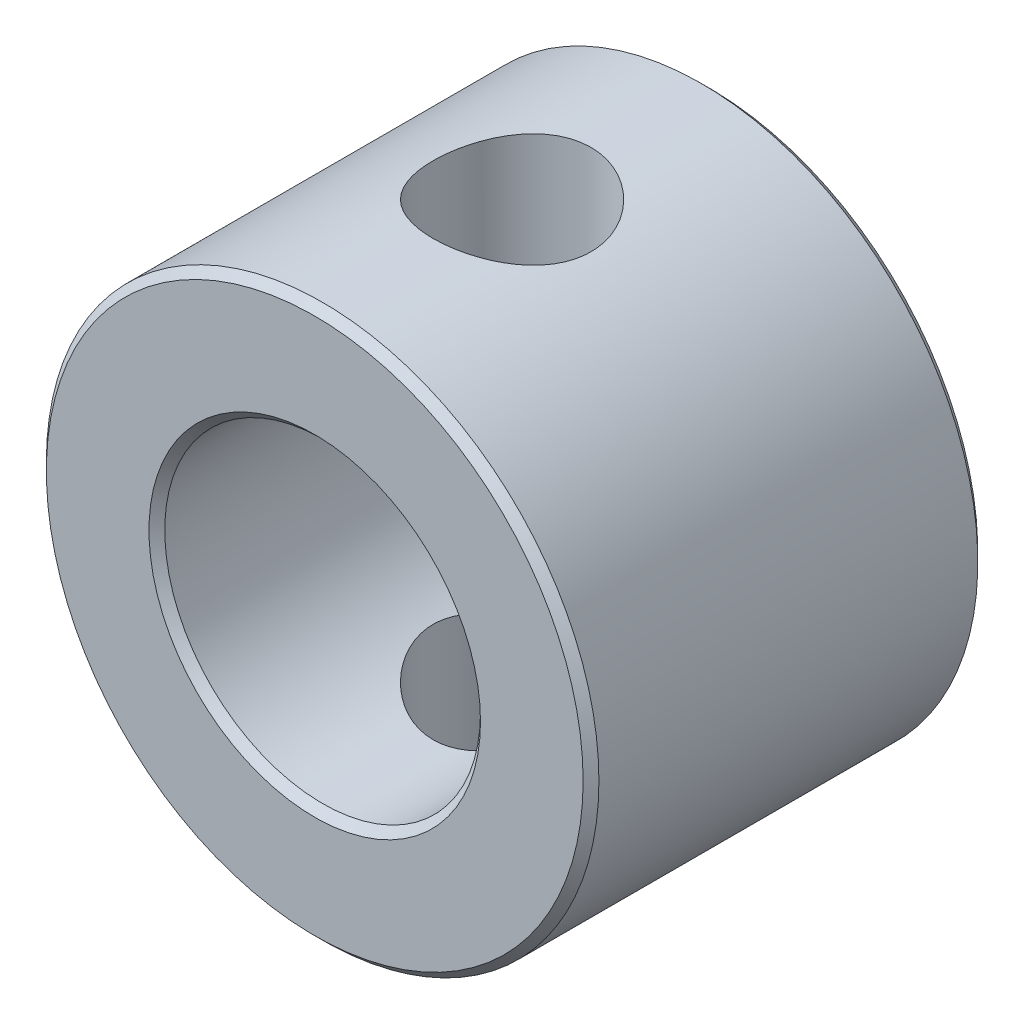
ISO-10303-21;
HEADER;
FILE_DESCRIPTION(('STEP AP214'),'2;1');
FILE_NAME('part.step','',(''),(''),'','','');
FILE_SCHEMA(('AUTOMOTIVE_DESIGN { 1 0 10303 214 1 1 1 1 }'));
ENDSEC;
DATA;
#1=APPLICATION_CONTEXT('core data for automotive mechanical design processes');
#2=APPLICATION_PROTOCOL_DEFINITION('international standard','automotive_design',2000,#1);
#3=PRODUCT_CONTEXT('',#1,'mechanical');
#4=PRODUCT('Part','Part','',(#3));
#5=PRODUCT_RELATED_PRODUCT_CATEGORY('part','',(#4));
#6=PRODUCT_DEFINITION_FORMATION('','',#4);
#7=PRODUCT_DEFINITION_CONTEXT('part definition',#1,'design');
#8=PRODUCT_DEFINITION('design','',#6,#7);
#9=PRODUCT_DEFINITION_SHAPE('','',#8);
#10=(LENGTH_UNIT() NAMED_UNIT(*) SI_UNIT(.MILLI.,.METRE.));
#11=(NAMED_UNIT(*) PLANE_ANGLE_UNIT() SI_UNIT($,.RADIAN.));
#12=(NAMED_UNIT(*) SI_UNIT($,.STERADIAN.) SOLID_ANGLE_UNIT());
#13=UNCERTAINTY_MEASURE_WITH_UNIT(LENGTH_MEASURE(1.E-05),#10,'distance_accuracy_value','');
#14=(GEOMETRIC_REPRESENTATION_CONTEXT(3) GLOBAL_UNCERTAINTY_ASSIGNED_CONTEXT((#13)) GLOBAL_UNIT_ASSIGNED_CONTEXT((#10,
#11,#12)) REPRESENTATION_CONTEXT('',''));
#15=CARTESIAN_POINT('',(0.,0.,0.));
#16=DIRECTION('',(0.,0.,1.));
#17=DIRECTION('',(1.,0.,0.));
#18=AXIS2_PLACEMENT_3D('',#15,#16,#17);
#19=CARTESIAN_POINT('',(0.,0.,10.));
#20=DIRECTION('',(0.,0.,-1.));
#21=DIRECTION('',(-1.,0.,0.));
#22=AXIS2_PLACEMENT_3D('',#19,#20,#21);
#23=CYLINDRICAL_SURFACE('',#22,7.);
#24=CARTESIAN_POINT('',(0.,0.,0.200000000008324));
#25=DIRECTION('',(0.,0.,-1.));
#26=DIRECTION('',(-1.,0.,0.));
#27=AXIS2_PLACEMENT_3D('',#24,#25,#26);
#28=CIRCLE('',#27,7.);
#29=CARTESIAN_POINT('',(-7.,0.,0.200000000008324));
#30=VERTEX_POINT('',#29);
#31=EDGE_CURVE('E51',#30,#30,#28,.F.);
#32=ORIENTED_EDGE('',*,*,#31,.T.);
#33=EDGE_LOOP('',(#32));
#34=FACE_BOUND('',#33,.T.);
#35=CARTESIAN_POINT('',(0.,0.,9.79999999993483));
#36=DIRECTION('',(0.,0.,1.));
#37=DIRECTION('',(1.,0.,0.));
#38=AXIS2_PLACEMENT_3D('',#35,#36,#37);
#39=CIRCLE('',#38,7.);
#40=CARTESIAN_POINT('',(7.,0.,9.79999999993483));
#41=VERTEX_POINT('',#40);
#42=EDGE_CURVE('E54',#41,#41,#39,.F.);
#43=ORIENTED_EDGE('',*,*,#42,.T.);
#44=EDGE_LOOP('',(#43));
#45=FACE_BOUND('',#44,.T.);
#46=CARTESIAN_POINT('',(0.,7.,6.99999999999999));
#47=CARTESIAN_POINT('',(0.10995490237725,6.99999869294341,6.99999806043804));
#48=CARTESIAN_POINT('',(0.21992974787258,6.99738417402043,6.99090221102387));
#49=CARTESIAN_POINT('',(0.436691991196986,6.98720905945103,6.95483572989768));
#50=CARTESIAN_POINT('',(0.543478166829612,6.97964659210084,6.9278583339259));
#51=CARTESIAN_POINT('',(0.750704300737866,6.96040691349073,6.85699196158349));
#52=CARTESIAN_POINT('',(0.851152880848219,6.94873544106341,6.81312656384804));
#53=CARTESIAN_POINT('',(1.04326876112927,6.92249978316544,6.70982200852164));
#54=CARTESIAN_POINT('',(1.13493514117816,6.90793529508023,6.65038122150963));
#55=CARTESIAN_POINT('',(1.30929444685894,6.8770473462558,6.51596498932708));
#56=CARTESIAN_POINT('',(1.39172372238093,6.86069041945191,6.44065524614472));
#57=CARTESIAN_POINT('',(1.54297135792434,6.82826734915642,6.27735225686231));
#58=CARTESIAN_POINT('',(1.61178767707782,6.81220124959344,6.18935711236776));
#59=CARTESIAN_POINT('',(1.73519790006429,6.78183014875388,6.00100641720908));
#60=CARTESIAN_POINT('',(1.78947821103347,6.76756702506018,5.90043801493513));
#61=CARTESIAN_POINT('',(1.88025170553979,6.74291343840667,5.69112798824923));
#62=CARTESIAN_POINT('',(1.91674871555718,6.73252214244871,5.58238812792911));
#63=CARTESIAN_POINT('',(1.96998433013874,6.71713608196017,5.36276523683446));
#64=CARTESIAN_POINT('',(1.98720553202849,6.71200978570012,5.25200863723217));
#65=CARTESIAN_POINT('',(2.00290667789183,6.70734208201996,5.0290688515539));
#66=CARTESIAN_POINT('',(2.0013906940962,6.70779946107612,4.91688598074978));
#67=CARTESIAN_POINT('',(1.98004134762902,6.71413034409934,4.69813138854384));
#68=CARTESIAN_POINT('',(1.9608032572839,6.71982782697936,4.59149564881924));
#69=CARTESIAN_POINT('',(1.90551386085788,6.73571348382811,4.38303278037241));
#70=CARTESIAN_POINT('',(1.86946103481249,6.74590206376404,4.2812060872795));
#71=CARTESIAN_POINT('',(1.78110681137811,6.7697686351608,4.08375375556819));
#72=CARTESIAN_POINT('',(1.72860551172881,6.78348916405649,3.98822292759834));
#73=CARTESIAN_POINT('',(1.60898379167884,6.81285216882059,3.8071234387866));
#74=CARTESIAN_POINT('',(1.54186011673344,6.82849507221912,3.7215570022651));
#75=CARTESIAN_POINT('',(1.3919039967302,6.86066250656356,3.55942762439364));
#76=CARTESIAN_POINT('',(1.30857487484532,6.87719804572366,3.48332552403278));
#77=CARTESIAN_POINT('',(1.13013228238622,6.90876247218345,3.34607399635973));
#78=CARTESIAN_POINT('',(1.03501820148189,6.92379128137826,3.2849253439583));
#79=CARTESIAN_POINT('',(0.834923073091443,6.95076528065502,3.17907126522597));
#80=CARTESIAN_POINT('',(0.729889817810003,6.96269275497229,3.13445971319583));
#81=CARTESIAN_POINT('',(0.513393229967469,6.98199251487585,3.06366610858319));
#82=CARTESIAN_POINT('',(0.401931525810146,6.98936594856255,3.03747941075474));
#83=CARTESIAN_POINT('',(0.179666388644351,6.99854874514672,3.00502671429056));
#84=CARTESIAN_POINT('',(0.0689613468605101,7.00053272850599,2.99813530462699));
#85=CARTESIAN_POINT('',(-0.152026526805579,6.99922084707091,3.00272726630105));
#86=CARTESIAN_POINT('',(-0.262309407757104,6.99592561580629,3.01420843284593));
#87=CARTESIAN_POINT('',(-0.47701863343031,6.98453926685206,3.05471044431627));
#88=CARTESIAN_POINT('',(-0.581518211734838,6.97654613017679,3.0833731813234));
#89=CARTESIAN_POINT('',(-0.784208686205634,6.95667998741884,3.15700050198468));
#90=CARTESIAN_POINT('',(-0.88239885124871,6.94480653265874,3.20196697088935));
#91=CARTESIAN_POINT('',(-1.07204168512002,6.91809961169145,3.30802333664513));
#92=CARTESIAN_POINT('',(-1.16330248654008,6.9032076317834,3.36944119882534));
#93=CARTESIAN_POINT('',(-1.33443852805946,6.87217947098441,3.5062525059511));
#94=CARTESIAN_POINT('',(-1.41431117084303,6.85604300755108,3.58164913006458));
#95=CARTESIAN_POINT('',(-1.56310642834006,6.82368619629444,3.74720934204945));
#96=CARTESIAN_POINT('',(-1.63158542740712,6.80748036858305,3.83777527555905));
#97=CARTESIAN_POINT('',(-1.75239531606755,6.77738894734787,4.02946258862467));
#98=CARTESIAN_POINT('',(-1.80472676748668,6.76350327310609,4.13058360077127));
#99=CARTESIAN_POINT('',(-1.89137454118277,6.73978651242836,4.34009121097522));
#100=CARTESIAN_POINT('',(-1.92578633239652,6.72993400029434,4.44843576349762));
#101=CARTESIAN_POINT('',(-1.97579450067868,6.71542456669526,4.66970993557479));
#102=CARTESIAN_POINT('',(-1.99139657901585,6.71076607094367,4.78263815507641));
#103=CARTESIAN_POINT('',(-2.0029802424685,6.70731703127619,5.00529603293678));
#104=CARTESIAN_POINT('',(-1.99968027644403,6.70831160808103,5.11498550455666));
#105=CARTESIAN_POINT('',(-1.97524710957465,6.71554597206102,5.33217473066169));
#106=CARTESIAN_POINT('',(-1.95411450379872,6.72178558421114,5.43967455809191));
#107=CARTESIAN_POINT('',(-1.89505968816674,6.73866977160528,5.64837837116859));
#108=CARTESIAN_POINT('',(-1.85731091786364,6.74926877048974,5.74963538701116));
#109=CARTESIAN_POINT('',(-1.7662294930158,6.77367302842112,5.94445873449219));
#110=CARTESIAN_POINT('',(-1.71289408043151,6.78747885482392,6.03802370127322));
#111=CARTESIAN_POINT('',(-1.59006546534827,6.81731668949935,6.21818352180532));
#112=CARTESIAN_POINT('',(-1.52009227722731,6.83340763179064,6.30444139134195));
#113=CARTESIAN_POINT('',(-1.36685984037934,6.86569845092232,6.4642238958098));
#114=CARTESIAN_POINT('',(-1.28359725072855,6.88189835417168,6.53774531911079));
#115=CARTESIAN_POINT('',(-1.10357432086539,6.91307959572365,6.67183718432661));
#116=CARTESIAN_POINT('',(-1.00652250235977,6.92801901037413,6.73202698726961));
#117=CARTESIAN_POINT('',(-0.803250529646656,6.95451395777971,6.835145785022));
#118=CARTESIAN_POINT('',(-0.697035424114735,6.96607133870287,6.87808421193305));
#119=CARTESIAN_POINT('',(-0.492916315335031,6.98327344725308,6.94084755139543));
#120=CARTESIAN_POINT('',(-0.395763007624388,6.98949684362076,6.96297353668455));
#121=CARTESIAN_POINT('',(-0.199078368786366,6.99786043852147,6.99254965724213));
#122=CARTESIAN_POINT('',(-0.099547357616091,7.00000118333996,7.00000175597687));
#123=CARTESIAN_POINT('',(0.,7.,6.99999999999999));
#124=B_SPLINE_CURVE_WITH_KNOTS('',3,(#46,#47,#48,#49,#50,#51,#52,#53,#54,#55,#56,#57,#58,#59,
#60,#61,#62,#63,#64,#65,#66,#67,#68,#69,#70,#71,#72,#73,#74,#75,#76,#77,#78,#79,#80,#81,#82,#83,
#84,#85,#86,#87,#88,#89,#90,#91,#92,#93,#94,#95,#96,#97,#98,#99,#100,#101,#102,#103,#104,#105,
#106,#107,#108,#109,#110,#111,#112,#113,#114,#115,#116,#117,#118,#119,#120,#121,#122,#123),
.UNSPECIFIED.,.T.,.F.,(4,2,2,2,2,2,2,2,2,2,2,2,2,2,2,2,2,2,2,2,2,2,2,2,2,2,2,2,2,2,2,2,2,2,2,2,
2,2,4),(0.,0.329499312542342,0.659123339795176,0.988288812895337,1.31748873543515,
1.6544781153078,1.99151797873712,2.33533075300056,2.67906951544808,3.01399509862748,
3.34884789231231,3.67284785829331,3.99687711786124,4.32500803291207,4.6532120557734,
4.99378500602498,5.33437560155446,5.67687101104445,6.01928004014609,6.35045457698197,
6.68158937434644,7.00605140479515,7.33055096575525,7.66207525344447,7.99367503187783,
8.33612104884329,8.67855514965293,9.01914573366133,9.35963305787728,9.68726681616466,
10.0148896418597,10.3391709629126,10.6635096999757,10.9986765689036,11.3339278310846,
11.6777797897016,12.0214434923408,12.3197946803794,12.6181059442771),.UNSPECIFIED.);
#125=CARTESIAN_POINT('',(0.,7.,6.99999999999999));
#126=VERTEX_POINT('',#125);
#127=EDGE_CURVE('E63',#126,#126,#124,.T.);
#128=ORIENTED_EDGE('',*,*,#127,.F.);
#129=EDGE_LOOP('',(#128));
#130=FACE_BOUND('',#129,.T.);
#131=CARTESIAN_POINT('',(0.,-7.,6.99999999999999));
#132=CARTESIAN_POINT('',(-0.109954902377249,-6.99999869294341,6.99999806043804));
#133=CARTESIAN_POINT('',(-0.219929747872578,-6.99738417402043,6.99090221102387));
#134=CARTESIAN_POINT('',(-0.436691991196984,-6.98720905945103,6.95483572989768));
#135=CARTESIAN_POINT('',(-0.54347816682961,-6.97964659210084,6.9278583339259));
#136=CARTESIAN_POINT('',(-0.750704300737864,-6.96040691349073,6.85699196158348));
#137=CARTESIAN_POINT('',(-0.851152880848217,-6.94873544106341,6.81312656384804));
#138=CARTESIAN_POINT('',(-1.04326876112926,-6.92249978316544,6.70982200852164));
#139=CARTESIAN_POINT('',(-1.13493514117816,-6.90793529508023,6.65038122150963));
#140=CARTESIAN_POINT('',(-1.30929444685894,-6.8770473462558,6.51596498932708));
#141=CARTESIAN_POINT('',(-1.39172372238093,-6.86069041945191,6.44065524614472));
#142=CARTESIAN_POINT('',(-1.54297135792434,-6.82826734915642,6.27735225686231));
#143=CARTESIAN_POINT('',(-1.61178767707781,-6.81220124959344,6.18935711236776));
#144=CARTESIAN_POINT('',(-1.73519790006429,-6.78183014875388,6.00100641720908));
#145=CARTESIAN_POINT('',(-1.78947821103347,-6.76756702506018,5.90043801493513));
#146=CARTESIAN_POINT('',(-1.88025170553979,-6.74291343840668,5.69112798824923));
#147=CARTESIAN_POINT('',(-1.91674871555718,-6.73252214244872,5.5823881279291));
#148=CARTESIAN_POINT('',(-1.96998433013874,-6.71713608196017,5.36276523683446));
#149=CARTESIAN_POINT('',(-1.98720553202848,-6.71200978570012,5.25200863723216));
#150=CARTESIAN_POINT('',(-2.00290667789183,-6.70734208201996,5.0290688515539));
#151=CARTESIAN_POINT('',(-2.00139069409619,-6.70779946107612,4.91688598074978));
#152=CARTESIAN_POINT('',(-1.98004134762902,-6.71413034409934,4.69813138854384));
#153=CARTESIAN_POINT('',(-1.9608032572839,-6.71982782697936,4.59149564881924));
#154=CARTESIAN_POINT('',(-1.90551386085788,-6.73571348382811,4.38303278037241));
#155=CARTESIAN_POINT('',(-1.86946103481248,-6.74590206376404,4.2812060872795));
#156=CARTESIAN_POINT('',(-1.78110681137811,-6.7697686351608,4.08375375556819));
#157=CARTESIAN_POINT('',(-1.7286055117288,-6.78348916405649,3.98822292759833));
#158=CARTESIAN_POINT('',(-1.60898379167883,-6.81285216882059,3.8071234387866));
#159=CARTESIAN_POINT('',(-1.54186011673344,-6.82849507221913,3.7215570022651));
#160=CARTESIAN_POINT('',(-1.3919039967302,-6.86066250656356,3.55942762439364));
#161=CARTESIAN_POINT('',(-1.30857487484532,-6.87719804572366,3.48332552403278));
#162=CARTESIAN_POINT('',(-1.13013228238622,-6.90876247218345,3.34607399635973));
#163=CARTESIAN_POINT('',(-1.03501820148188,-6.92379128137826,3.2849253439583));
#164=CARTESIAN_POINT('',(-0.834923073091437,-6.95076528065502,3.17907126522597));
#165=CARTESIAN_POINT('',(-0.729889817809997,-6.96269275497229,3.13445971319583));
#166=CARTESIAN_POINT('',(-0.513393229967463,-6.98199251487585,3.06366610858319));
#167=CARTESIAN_POINT('',(-0.401931525810141,-6.98936594856255,3.03747941075474));
#168=CARTESIAN_POINT('',(-0.179666388644346,-6.99854874514672,3.00502671429056));
#169=CARTESIAN_POINT('',(-0.0689613468605046,-7.00053272850599,2.99813530462699));
#170=CARTESIAN_POINT('',(0.152026526805585,-6.99922084707091,3.00272726630105));
#171=CARTESIAN_POINT('',(0.262309407757109,-6.99592561580629,3.01420843284593));
#172=CARTESIAN_POINT('',(0.477018633430315,-6.98453926685206,3.05471044431627));
#173=CARTESIAN_POINT('',(0.581518211734843,-6.97654613017679,3.0833731813234));
#174=CARTESIAN_POINT('',(0.784208686205639,-6.95667998741884,3.15700050198468));
#175=CARTESIAN_POINT('',(0.882398851248715,-6.94480653265874,3.20196697088935));
#176=CARTESIAN_POINT('',(1.07204168512003,-6.91809961169145,3.30802333664513));
#177=CARTESIAN_POINT('',(1.16330248654008,-6.9032076317834,3.36944119882534));
#178=CARTESIAN_POINT('',(1.33443852805947,-6.87217947098441,3.50625250595111));
#179=CARTESIAN_POINT('',(1.41431117084304,-6.85604300755108,3.58164913006458));
#180=CARTESIAN_POINT('',(1.56310642834006,-6.82368619629444,3.74720934204945));
#181=CARTESIAN_POINT('',(1.63158542740713,-6.80748036858305,3.83777527555905));
#182=CARTESIAN_POINT('',(1.75239531606756,-6.77738894734787,4.02946258862467));
#183=CARTESIAN_POINT('',(1.80472676748669,-6.76350327310609,4.13058360077127));
#184=CARTESIAN_POINT('',(1.89137454118277,-6.73978651242836,4.34009121097522));
#185=CARTESIAN_POINT('',(1.92578633239653,-6.72993400029434,4.44843576349762));
#186=CARTESIAN_POINT('',(1.97579450067869,-6.71542456669526,4.66970993557479));
#187=CARTESIAN_POINT('',(1.99139657901586,-6.71076607094367,4.78263815507641));
#188=CARTESIAN_POINT('',(2.0029802424685,-6.70731703127619,5.00529603293678));
#189=CARTESIAN_POINT('',(1.99968027644404,-6.70831160808103,5.11498550455666));
#190=CARTESIAN_POINT('',(1.97524710957465,-6.71554597206102,5.33217473066169));
#191=CARTESIAN_POINT('',(1.95411450379872,-6.72178558421114,5.43967455809192));
#192=CARTESIAN_POINT('',(1.89505968816674,-6.73866977160528,5.6483783711686));
#193=CARTESIAN_POINT('',(1.85731091786364,-6.74926877048974,5.74963538701117));
#194=CARTESIAN_POINT('',(1.7662294930158,-6.77367302842112,5.94445873449219));
#195=CARTESIAN_POINT('',(1.71289408043151,-6.78747885482392,6.03802370127322));
#196=CARTESIAN_POINT('',(1.59006546534827,-6.81731668949935,6.21818352180532));
#197=CARTESIAN_POINT('',(1.52009227722731,-6.83340763179064,6.30444139134195));
#198=CARTESIAN_POINT('',(1.36685984037934,-6.86569845092232,6.46422389580981));
#199=CARTESIAN_POINT('',(1.28359725072855,-6.88189835417168,6.53774531911079));
#200=CARTESIAN_POINT('',(1.10357432086539,-6.91307959572365,6.67183718432661));
#201=CARTESIAN_POINT('',(1.00652250235978,-6.92801901037413,6.73202698726962));
#202=CARTESIAN_POINT('',(0.803250529646657,-6.95451395777971,6.835145785022));
#203=CARTESIAN_POINT('',(0.697035424114735,-6.96607133870287,6.87808421193305));
#204=CARTESIAN_POINT('',(0.492916315335032,-6.98327344725308,6.94084755139543));
#205=CARTESIAN_POINT('',(0.395763007624389,-6.98949684362076,6.96297353668455));
#206=CARTESIAN_POINT('',(0.199078368786367,-6.99786043852147,6.99254965724213));
#207=CARTESIAN_POINT('',(0.0995473576160927,-7.00000118333996,7.00000175597687));
#208=CARTESIAN_POINT('',(0.,-7.,6.99999999999999));
#209=B_SPLINE_CURVE_WITH_KNOTS('',3,(#131,#132,#133,#134,#135,#136,#137,#138,#139,#140,#141,
#142,#143,#144,#145,#146,#147,#148,#149,#150,#151,#152,#153,#154,#155,#156,#157,#158,#159,#160,
#161,#162,#163,#164,#165,#166,#167,#168,#169,#170,#171,#172,#173,#174,#175,#176,#177,#178,#179,
#180,#181,#182,#183,#184,#185,#186,#187,#188,#189,#190,#191,#192,#193,#194,#195,#196,#197,#198,
#199,#200,#201,#202,#203,#204,#205,#206,#207,#208),.UNSPECIFIED.,.T.,.F.,(4,2,2,2,2,2,2,2,2,2,2,
2,2,2,2,2,2,2,2,2,2,2,2,2,2,2,2,2,2,2,2,2,2,2,2,2,2,2,4),(0.,0.329499312542342,
0.659123339795176,0.988288812895337,1.31748873543515,1.6544781153078,1.99151797873712,
2.33533075300056,2.67906951544808,3.01399509862748,3.34884789231231,3.67284785829331,
3.99687711786124,4.32500803291207,4.6532120557734,4.99378500602499,5.33437560155446,
5.67687101104445,6.01928004014609,6.35045457698197,6.68158937434645,7.00605140479516,
7.33055096575525,7.66207525344447,7.99367503187783,8.3361210488433,8.67855514965293,
9.01914573366134,9.35963305787729,9.68726681616467,10.0148896418597,10.3391709629126,
10.6635096999757,10.9986765689036,11.3339278310847,11.6777797897016,12.0214434923408,
12.3197946803794,12.6181059442771),.UNSPECIFIED.);
#210=CARTESIAN_POINT('',(0.,-7.,6.99999999999999));
#211=VERTEX_POINT('',#210);
#212=EDGE_CURVE('E71',#211,#211,#209,.T.);
#213=ORIENTED_EDGE('',*,*,#212,.F.);
#214=EDGE_LOOP('',(#213));
#215=FACE_BOUND('',#214,.T.);
#216=ADVANCED_FACE('F31',(#34,#45,#130,#215),#23,.T.);
#217=CARTESIAN_POINT('',(7.,0.,10.));
#218=DIRECTION('',(0.,0.,1.));
#219=DIRECTION('',(1.,0.,0.));
#220=AXIS2_PLACEMENT_3D('',#217,#218,#219);
#221=PLANE('',#220);
#222=CARTESIAN_POINT('',(0.,0.,10.));
#223=DIRECTION('',(0.,0.,1.));
#224=DIRECTION('',(1.,0.,0.));
#225=AXIS2_PLACEMENT_3D('',#222,#223,#224);
#226=CIRCLE('',#225,6.79999999999168);
#227=CARTESIAN_POINT('',(6.79999999999168,0.,10.));
#228=VERTEX_POINT('',#227);
#229=EDGE_CURVE('E42',#228,#228,#226,.T.);
#230=ORIENTED_EDGE('',*,*,#229,.T.);
#231=EDGE_LOOP('',(#230));
#232=FACE_BOUND('',#231,.T.);
#233=CARTESIAN_POINT('',(0.,0.,10.));
#234=DIRECTION('',(0.,0.,1.));
#235=DIRECTION('',(1.,0.,0.));
#236=AXIS2_PLACEMENT_3D('',#233,#234,#235);
#237=CIRCLE('',#236,4.20000000000831);
#238=CARTESIAN_POINT('',(4.20000000000831,0.,10.));
#239=VERTEX_POINT('',#238);
#240=EDGE_CURVE('E46',#239,#239,#237,.F.);
#241=ORIENTED_EDGE('',*,*,#240,.T.);
#242=EDGE_LOOP('',(#241));
#243=FACE_BOUND('',#242,.T.);
#244=ADVANCED_FACE('F115',(#232,#243),#221,.T.);
#245=CARTESIAN_POINT('',(0.,0.,0.));
#246=DIRECTION('',(0.,0.,-1.));
#247=DIRECTION('',(-1.,0.,0.));
#248=AXIS2_PLACEMENT_3D('',#245,#246,#247);
#249=PLANE('',#248);
#250=CARTESIAN_POINT('',(0.,0.,0.));
#251=DIRECTION('',(0.,0.,-1.));
#252=DIRECTION('',(-1.,0.,0.));
#253=AXIS2_PLACEMENT_3D('',#250,#251,#252);
#254=CIRCLE('',#253,6.79999999993484);
#255=CARTESIAN_POINT('',(-6.79999999993484,0.,0.));
#256=VERTEX_POINT('',#255);
#257=EDGE_CURVE('E57',#256,#256,#254,.T.);
#258=ORIENTED_EDGE('',*,*,#257,.T.);
#259=EDGE_LOOP('',(#258));
#260=FACE_BOUND('',#259,.T.);
#261=CARTESIAN_POINT('',(0.,0.,0.));
#262=DIRECTION('',(0.,0.,-1.));
#263=DIRECTION('',(-1.,0.,0.));
#264=AXIS2_PLACEMENT_3D('',#261,#262,#263);
#265=CIRCLE('',#264,4.20000000006516);
#266=CARTESIAN_POINT('',(-4.20000000006516,0.,0.));
#267=VERTEX_POINT('',#266);
#268=EDGE_CURVE('E60',#267,#267,#265,.F.);
#269=ORIENTED_EDGE('',*,*,#268,.T.);
#270=EDGE_LOOP('',(#269));
#271=FACE_BOUND('',#270,.T.);
#272=ADVANCED_FACE('F103',(#260,#271),#249,.T.);
#273=CARTESIAN_POINT('',(0.,0.,10.));
#274=DIRECTION('',(0.,0.,1.));
#275=DIRECTION('',(1.,0.,0.));
#276=AXIS2_PLACEMENT_3D('',#273,#274,#275);
#277=CYLINDRICAL_SURFACE('',#276,3.99999999999999);
#278=CARTESIAN_POINT('',(0.,0.,0.200000000008327));
#279=DIRECTION('',(0.,0.,-1.));
#280=DIRECTION('',(-1.,0.,0.));
#281=AXIS2_PLACEMENT_3D('',#278,#279,#280);
#282=CIRCLE('',#281,3.99999999999999);
#283=CARTESIAN_POINT('',(-3.99999999999999,0.,0.200000000008327));
#284=VERTEX_POINT('',#283);
#285=EDGE_CURVE('E10',#284,#284,#282,.T.);
#286=ORIENTED_EDGE('',*,*,#285,.T.);
#287=EDGE_LOOP('',(#286));
#288=FACE_BOUND('',#287,.T.);
#289=CARTESIAN_POINT('',(0.,0.,9.79999999993483));
#290=DIRECTION('',(0.,0.,1.));
#291=DIRECTION('',(1.,0.,0.));
#292=AXIS2_PLACEMENT_3D('',#289,#290,#291);
#293=CIRCLE('',#292,3.99999999999999);
#294=CARTESIAN_POINT('',(3.99999999999999,0.,9.79999999993483));
#295=VERTEX_POINT('',#294);
#296=EDGE_CURVE('E38',#295,#295,#293,.T.);
#297=ORIENTED_EDGE('',*,*,#296,.T.);
#298=EDGE_LOOP('',(#297));
#299=FACE_BOUND('',#298,.T.);
#300=CARTESIAN_POINT('',(0.,-3.99999999999999,6.99999999999999));
#301=CARTESIAN_POINT('',(-0.105143925902464,-3.99999426810081,6.9999933953656));
#302=CARTESIAN_POINT('',(-0.210413199395122,-3.99580982039511,6.99165985375788));
#303=CARTESIAN_POINT('',(-0.417840470537788,-3.97948312074313,6.95869423931691));
#304=CARTESIAN_POINT('',(-0.519992173427254,-3.96732575657838,6.93403121400436));
#305=CARTESIAN_POINT('',(-0.717867089760892,-3.93632558806749,6.86961238276673));
#306=CARTESIAN_POINT('',(-0.813613605878286,-3.91750878355074,6.82991523150405));
#307=CARTESIAN_POINT('',(-0.996945233613189,-3.87491553031522,6.73685875727002));
#308=CARTESIAN_POINT('',(-1.08453098798011,-3.8511394726705,6.68350051150226));
#309=CARTESIAN_POINT('',(-1.25501563552381,-3.79912516516123,6.56096550102942));
#310=CARTESIAN_POINT('',(-1.33731042224421,-3.77070398255073,6.49102704152071));
#311=CARTESIAN_POINT('',(-1.48955888973395,-3.71319940493485,6.33895704150592));
#312=CARTESIAN_POINT('',(-1.55950316621352,-3.68411552418068,6.25681629645511));
#313=CARTESIAN_POINT('',(-1.69050400090054,-3.62597902394694,6.07503330095323));
#314=CARTESIAN_POINT('',(-1.75045067110326,-3.59710373940263,5.97452780330817));
#315=CARTESIAN_POINT('',(-1.85233645378138,-3.5457195754464,5.76326532802757));
#316=CARTESIAN_POINT('',(-1.89428842993265,-3.52320615213979,5.6525157425545));
#317=CARTESIAN_POINT('',(-1.95626488437716,-3.48915734075616,5.43066978915615));
#318=CARTESIAN_POINT('',(-1.97745171416087,-3.47704543167426,5.31999109586521));
#319=CARTESIAN_POINT('',(-2.00085398661768,-3.46363779897055,5.09604232444105));
#320=CARTESIAN_POINT('',(-2.00308817674613,-3.46233138686576,4.98277491825769));
#321=CARTESIAN_POINT('',(-1.98937457434457,-3.47021860514496,4.77142795136927));
#322=CARTESIAN_POINT('',(-1.97556911907363,-3.47817527324026,4.6731519375539));
#323=CARTESIAN_POINT('',(-1.93387969811385,-3.501524574677,4.48055618125392));
#324=CARTESIAN_POINT('',(-1.90599124779529,-3.51691957663552,4.38623770938937));
#325=CARTESIAN_POINT('',(-1.836419560772,-3.55374952825481,4.20154173486869));
#326=CARTESIAN_POINT('',(-1.79443013423198,-3.57531681327996,4.11130720242843));
#327=CARTESIAN_POINT('',(-1.69808337533599,-3.62206808562807,3.93873141481999));
#328=CARTESIAN_POINT('',(-1.64372048762492,-3.6472536956038,3.85639372879983));
#329=CARTESIAN_POINT('',(-1.51613210982557,-3.70226315806571,3.69095749451356));
#330=CARTESIAN_POINT('',(-1.44138891673855,-3.73227020473491,3.60908625284769));
#331=CARTESIAN_POINT('',(-1.27911115748274,-3.79095246600814,3.45852916281821));
#332=CARTESIAN_POINT('',(-1.19157051314856,-3.81962703917601,3.38984961593224));
#333=CARTESIAN_POINT('',(-1.00103301166369,-3.87403974565927,3.26462867794056));
#334=CARTESIAN_POINT('',(-0.89750718319881,-3.89957968324013,3.20879905510853));
#335=CARTESIAN_POINT('',(-0.680932430977587,-3.94315762242484,3.11580594191399));
#336=CARTESIAN_POINT('',(-0.567891152530546,-3.96120157887105,3.07862762996968));
#337=CARTESIAN_POINT('',(-0.3455329833214,-3.9864866748287,3.02704919256666));
#338=CARTESIAN_POINT('',(-0.236683061096649,-3.99449876602619,3.01101752850645));
#339=CARTESIAN_POINT('',(-0.017559199898701,-4.00146026918206,2.99707053773104));
#340=CARTESIAN_POINT('',(0.0927140397398191,-4.00041397442636,2.99914662872108));
#341=CARTESIAN_POINT('',(0.302465943971974,-3.98982384506869,3.0204133768375));
#342=CARTESIAN_POINT('',(0.40211881609986,-3.98094491376335,3.03826506546));
#343=CARTESIAN_POINT('',(0.596813784603881,-3.95644342629679,3.08847614379025));
#344=CARTESIAN_POINT('',(0.691855371382172,-3.94082012668822,3.120837132907));
#345=CARTESIAN_POINT('',(0.877777216899142,-3.90368502827175,3.19999693286608));
#346=CARTESIAN_POINT('',(0.968460794011603,-3.8820176353926,3.24718210023259));
#347=CARTESIAN_POINT('',(1.14092272339854,-3.83487948634834,3.35421507129315));
#348=CARTESIAN_POINT('',(1.22269725955318,-3.80940711133875,3.4140682691908));
#349=CARTESIAN_POINT('',(1.38353537857842,-3.75416442672395,3.55152085066144));
#350=CARTESIAN_POINT('',(1.46154415563805,-3.72421769686997,3.6302857368903));
#351=CARTESIAN_POINT('',(1.6037126422377,-3.66524783217639,3.79985030255546));
#352=CARTESIAN_POINT('',(1.66786277142374,-3.63622534800093,3.89065823769585));
#353=CARTESIAN_POINT('',(1.78341582895803,-3.58102384412978,4.08728730834596));
#354=CARTESIAN_POINT('',(1.83405099160049,-3.5550505917812,4.19362253218897));
#355=CARTESIAN_POINT('',(1.9161656518694,-3.51148144588269,4.41502013514994));
#356=CARTESIAN_POINT('',(1.94766983173402,-3.49387476443499,4.53007105293379));
#357=CARTESIAN_POINT('',(1.98772337493373,-3.47123002051603,4.75382044576941));
#358=CARTESIAN_POINT('',(1.99818599281089,-3.46514766930129,4.86206850687049));
#359=CARTESIAN_POINT('',(2.00137830875239,-3.46330709283206,5.07889413432905));
#360=CARTESIAN_POINT('',(1.99411569324647,-3.46754439252779,5.18747153747572));
#361=CARTESIAN_POINT('',(1.96385225118661,-3.48475724102152,5.39096700306687));
#362=CARTESIAN_POINT('',(1.94241662868606,-3.49686188965316,5.48620094028948));
#363=CARTESIAN_POINT('',(1.88635071644881,-3.52742032375304,5.67161623884873));
#364=CARTESIAN_POINT('',(1.85171618231983,-3.54587615139336,5.76179596418406));
#365=CARTESIAN_POINT('',(1.76763149060112,-3.58857060729071,5.94124970197307));
#366=CARTESIAN_POINT('',(1.71734227563139,-3.6131144479184,6.03005580365805));
#367=CARTESIAN_POINT('',(1.60430194327477,-3.6647066326972,6.19854907236251));
#368=CARTESIAN_POINT('',(1.54154434248311,-3.6917562759122,6.27823146104222));
#369=CARTESIAN_POINT('',(1.39640665332274,-3.74924646316183,6.43628396470934));
#370=CARTESIAN_POINT('',(1.31256884599451,-3.77969966613255,6.51331820470057));
#371=CARTESIAN_POINT('',(1.13230961246639,-3.8375550451986,6.65252596687053));
#372=CARTESIAN_POINT('',(1.03588144661039,-3.86495557252389,6.7146914789398));
#373=CARTESIAN_POINT('',(0.831863193565885,-3.91396019133074,6.82247272542413));
#374=CARTESIAN_POINT('',(0.724199007553456,-3.93552192987865,6.86796833847293));
#375=CARTESIAN_POINT('',(0.501484202276169,-3.97002682597973,6.93961633551481));
#376=CARTESIAN_POINT('',(0.386455599178197,-3.98299446726134,6.96582369361141));
#377=CARTESIAN_POINT('',(0.225203892981789,-3.99390923826955,6.98779482217147));
#378=CARTESIAN_POINT('',(0.180323758883129,-3.996187306805,6.99236528173267));
#379=CARTESIAN_POINT('',(0.0903034636101835,-3.9992339395363,6.99846933102816));
#380=CARTESIAN_POINT('',(0.0451632952932579,-4.00000246206761,7.00000283694041));
#381=CARTESIAN_POINT('',(0.,-3.99999999999999,6.99999999999999));
#382=B_SPLINE_CURVE_WITH_KNOTS('',3,(#300,#301,#302,#303,#304,#305,#306,#307,#308,#309,#310,
#311,#312,#313,#314,#315,#316,#317,#318,#319,#320,#321,#322,#323,#324,#325,#326,#327,#328,#329,
#330,#331,#332,#333,#334,#335,#336,#337,#338,#339,#340,#341,#342,#343,#344,#345,#346,#347,#348,
#349,#350,#351,#352,#353,#354,#355,#356,#357,#358,#359,#360,#361,#362,#363,#364,#365,#366,#367,
#368,#369,#370,#371,#372,#373,#374,#375,#376,#377,#378,#379,#380,#381),.UNSPECIFIED.,.T.,.F.,(4,
2,2,2,2,2,2,2,2,2,2,2,2,2,2,2,2,2,2,2,2,2,2,2,2,2,2,2,2,2,2,2,2,2,2,2,2,2,2,2,4),(0.,
0.315248514840583,0.631096299418391,0.945724310984591,1.26032752116313,1.59396351743617,
1.92785247530806,2.28763452861504,2.6471589579656,2.98516024280457,3.32282714658039,
3.62011424818639,3.91749607851354,4.22180480336972,4.52625042520441,4.86929882667754,
5.21251069197369,5.57166044428878,5.93052433824555,6.25966580942687,6.58865129022948,
6.89213813012239,7.19565843261858,7.50785712055792,7.82018901496674,8.16319221288832,
8.50643177230858,8.86629364323446,9.22569023890896,9.55058615006087,9.87534119729351,
10.1691586049771,10.463070575767,10.7767291356057,11.0905512228725,11.4425048551434,
11.7946476676248,12.1492802732705,12.5028981724229,12.6383056026783,12.7737167702212),.UNSPECIFIED.);
#383=CARTESIAN_POINT('',(0.,-3.99999999999999,6.99999999999999));
#384=VERTEX_POINT('',#383);
#385=EDGE_CURVE('E70',#384,#384,#382,.T.);
#386=ORIENTED_EDGE('',*,*,#385,.T.);
#387=EDGE_LOOP('',(#386));
#388=FACE_BOUND('',#387,.T.);
#389=CARTESIAN_POINT('',(0.,3.99999999999999,6.99999999999999));
#390=CARTESIAN_POINT('',(0.105143925902468,3.99999426810081,6.9999933953656));
#391=CARTESIAN_POINT('',(0.210413199395125,3.99580982039511,6.99165985375788));
#392=CARTESIAN_POINT('',(0.417840470537791,3.97948312074313,6.95869423931691));
#393=CARTESIAN_POINT('',(0.519992173427258,3.96732575657838,6.93403121400436));
#394=CARTESIAN_POINT('',(0.717867089760895,3.93632558806749,6.86961238276673));
#395=CARTESIAN_POINT('',(0.81361360587829,3.91750878355074,6.82991523150405));
#396=CARTESIAN_POINT('',(0.996945233613193,3.87491553031522,6.73685875727002));
#397=CARTESIAN_POINT('',(1.08453098798011,3.85113947267049,6.68350051150226));
#398=CARTESIAN_POINT('',(1.25501563552381,3.79912516516123,6.56096550102942));
#399=CARTESIAN_POINT('',(1.33731042224421,3.77070398255073,6.49102704152071));
#400=CARTESIAN_POINT('',(1.48955888973395,3.71319940493485,6.33895704150592));
#401=CARTESIAN_POINT('',(1.55950316621353,3.68411552418068,6.25681629645511));
#402=CARTESIAN_POINT('',(1.69050400090055,3.62597902394694,6.07503330095323));
#403=CARTESIAN_POINT('',(1.75045067110327,3.59710373940263,5.97452780330817));
#404=CARTESIAN_POINT('',(1.85233645378138,3.5457195754464,5.76326532802757));
#405=CARTESIAN_POINT('',(1.89428842993266,3.52320615213978,5.6525157425545));
#406=CARTESIAN_POINT('',(1.95626488437717,3.48915734075616,5.43066978915615));
#407=CARTESIAN_POINT('',(1.97745171416087,3.47704543167426,5.31999109586521));
#408=CARTESIAN_POINT('',(2.00085398661768,3.46363779897055,5.09604232444105));
#409=CARTESIAN_POINT('',(2.00308817674614,3.46233138686575,4.98277491825769));
#410=CARTESIAN_POINT('',(1.98937457434458,3.47021860514496,4.77142795136926));
#411=CARTESIAN_POINT('',(1.97556911907363,3.47817527324026,4.6731519375539));
#412=CARTESIAN_POINT('',(1.93387969811385,3.501524574677,4.48055618125392));
#413=CARTESIAN_POINT('',(1.90599124779529,3.51691957663552,4.38623770938937));
#414=CARTESIAN_POINT('',(1.836419560772,3.55374952825481,4.20154173486869));
#415=CARTESIAN_POINT('',(1.79443013423198,3.57531681327996,4.11130720242843));
#416=CARTESIAN_POINT('',(1.698083375336,3.62206808562806,3.93873141481999));
#417=CARTESIAN_POINT('',(1.64372048762493,3.6472536956038,3.85639372879983));
#418=CARTESIAN_POINT('',(1.51613210982557,3.70226315806571,3.69095749451356));
#419=CARTESIAN_POINT('',(1.44138891673856,3.73227020473491,3.60908625284769));
#420=CARTESIAN_POINT('',(1.27911115748274,3.79095246600813,3.45852916281821));
#421=CARTESIAN_POINT('',(1.19157051314856,3.81962703917601,3.38984961593224));
#422=CARTESIAN_POINT('',(1.00103301166369,3.87403974565927,3.26462867794056));
#423=CARTESIAN_POINT('',(0.897507183198813,3.89957968324013,3.20879905510853));
#424=CARTESIAN_POINT('',(0.68093243097759,3.94315762242483,3.11580594191399));
#425=CARTESIAN_POINT('',(0.567891152530549,3.96120157887105,3.07862762996968));
#426=CARTESIAN_POINT('',(0.345532983321403,3.9864866748287,3.02704919256666));
#427=CARTESIAN_POINT('',(0.236683061096651,3.99449876602619,3.01101752850645));
#428=CARTESIAN_POINT('',(0.0175591998987036,4.00146026918206,2.99707053773104));
#429=CARTESIAN_POINT('',(-0.0927140397398164,4.00041397442636,2.99914662872108));
#430=CARTESIAN_POINT('',(-0.302465943971971,3.98982384506869,3.0204133768375));
#431=CARTESIAN_POINT('',(-0.402118816099857,3.98094491376335,3.03826506546));
#432=CARTESIAN_POINT('',(-0.596813784603878,3.95644342629679,3.08847614379026));
#433=CARTESIAN_POINT('',(-0.691855371382169,3.94082012668822,3.120837132907));
#434=CARTESIAN_POINT('',(-0.87777721689914,3.90368502827175,3.19999693286608));
#435=CARTESIAN_POINT('',(-0.9684607940116,3.8820176353926,3.24718210023259));
#436=CARTESIAN_POINT('',(-1.14092272339854,3.83487948634834,3.35421507129315));
#437=CARTESIAN_POINT('',(-1.22269725955318,3.80940711133875,3.4140682691908));
#438=CARTESIAN_POINT('',(-1.38353537857842,3.75416442672395,3.55152085066144));
#439=CARTESIAN_POINT('',(-1.46154415563804,3.72421769686997,3.6302857368903));
#440=CARTESIAN_POINT('',(-1.6037126422377,3.66524783217639,3.79985030255546));
#441=CARTESIAN_POINT('',(-1.66786277142373,3.63622534800093,3.89065823769585));
#442=CARTESIAN_POINT('',(-1.78341582895802,3.58102384412978,4.08728730834596));
#443=CARTESIAN_POINT('',(-1.83405099160048,3.55505059178121,4.19362253218897));
#444=CARTESIAN_POINT('',(-1.91616565186939,3.51148144588269,4.41502013514994));
#445=CARTESIAN_POINT('',(-1.94766983173402,3.49387476443499,4.53007105293378));
#446=CARTESIAN_POINT('',(-1.98772337493373,3.47123002051603,4.75382044576941));
#447=CARTESIAN_POINT('',(-1.99818599281089,3.46514766930129,4.86206850687049));
#448=CARTESIAN_POINT('',(-2.00137830875239,3.46330709283206,5.07889413432905));
#449=CARTESIAN_POINT('',(-1.99411569324647,3.46754439252779,5.18747153747572));
#450=CARTESIAN_POINT('',(-1.9638522511866,3.48475724102153,5.39096700306687));
#451=CARTESIAN_POINT('',(-1.94241662868605,3.49686188965316,5.48620094028948));
#452=CARTESIAN_POINT('',(-1.88635071644881,3.52742032375305,5.67161623884873));
#453=CARTESIAN_POINT('',(-1.85171618231983,3.54587615139336,5.76179596418406));
#454=CARTESIAN_POINT('',(-1.76763149060111,3.58857060729071,5.94124970197307));
#455=CARTESIAN_POINT('',(-1.71734227563139,3.6131144479184,6.03005580365805));
#456=CARTESIAN_POINT('',(-1.60430194327477,3.6647066326972,6.19854907236251));
#457=CARTESIAN_POINT('',(-1.54154434248311,3.69175627591221,6.27823146104222));
#458=CARTESIAN_POINT('',(-1.39640665332273,3.74924646316183,6.43628396470934));
#459=CARTESIAN_POINT('',(-1.31256884599451,3.77969966613255,6.51331820470058));
#460=CARTESIAN_POINT('',(-1.13230961246638,3.83755504519861,6.65252596687053));
#461=CARTESIAN_POINT('',(-1.03588144661038,3.86495557252389,6.7146914789398));
#462=CARTESIAN_POINT('',(-0.83186319356588,3.91396019133074,6.82247272542413));
#463=CARTESIAN_POINT('',(-0.72419900755345,3.93552192987865,6.86796833847293));
#464=CARTESIAN_POINT('',(-0.501484202276163,3.97002682597973,6.93961633551481));
#465=CARTESIAN_POINT('',(-0.386455599178191,3.98299446726135,6.96582369361141));
#466=CARTESIAN_POINT('',(-0.225203892981783,3.99390923826955,6.98779482217147));
#467=CARTESIAN_POINT('',(-0.180323758883124,3.996187306805,6.99236528173267));
#468=CARTESIAN_POINT('',(-0.0903034636101792,3.9992339395363,6.99846933102816));
#469=CARTESIAN_POINT('',(-0.0451632952932541,4.00000246206761,7.00000283694041));
#470=CARTESIAN_POINT('',(0.,3.99999999999999,6.99999999999999));
#471=B_SPLINE_CURVE_WITH_KNOTS('',3,(#389,#390,#391,#392,#393,#394,#395,#396,#397,#398,#399,
#400,#401,#402,#403,#404,#405,#406,#407,#408,#409,#410,#411,#412,#413,#414,#415,#416,#417,#418,
#419,#420,#421,#422,#423,#424,#425,#426,#427,#428,#429,#430,#431,#432,#433,#434,#435,#436,#437,
#438,#439,#440,#441,#442,#443,#444,#445,#446,#447,#448,#449,#450,#451,#452,#453,#454,#455,#456,
#457,#458,#459,#460,#461,#462,#463,#464,#465,#466,#467,#468,#469,#470),.UNSPECIFIED.,.T.,.F.,(4,
2,2,2,2,2,2,2,2,2,2,2,2,2,2,2,2,2,2,2,2,2,2,2,2,2,2,2,2,2,2,2,2,2,2,2,2,2,2,2,4),(0.,
0.315248514840583,0.631096299418392,0.945724310984591,1.26032752116313,1.59396351743617,
1.92785247530806,2.28763452861504,2.6471589579656,2.98516024280457,3.32282714658039,
3.62011424818639,3.91749607851354,4.22180480336972,4.52625042520441,4.86929882667754,
5.21251069197369,5.57166044428878,5.93052433824555,6.25966580942687,6.58865129022948,
6.8921381301224,7.19565843261859,7.50785712055793,7.82018901496674,8.16319221288832,
8.50643177230858,8.86629364323446,9.22569023890896,9.55058615006087,9.87534119729351,
10.1691586049771,10.463070575767,10.7767291356057,11.0905512228726,11.4425048551434,
11.7946476676248,12.1492802732705,12.5028981724229,12.6383056026783,12.7737167702212),.UNSPECIFIED.);
#472=CARTESIAN_POINT('',(0.,3.99999999999999,6.99999999999999));
#473=VERTEX_POINT('',#472);
#474=EDGE_CURVE('E91',#473,#473,#471,.T.);
#475=ORIENTED_EDGE('',*,*,#474,.T.);
#476=EDGE_LOOP('',(#475));
#477=FACE_BOUND('',#476,.T.);
#478=ADVANCED_FACE('F83',(#288,#299,#388,#477),#277,.F.);
#479=CARTESIAN_POINT('',(0.,7.,5.));
#480=DIRECTION('',(0.,1.,0.));
#481=DIRECTION('',(0.,0.,1.));
#482=AXIS2_PLACEMENT_3D('',#479,#480,#481);
#483=CYLINDRICAL_SURFACE('',#482,1.99999999999999);
#484=ORIENTED_EDGE('',*,*,#212,.T.);
#485=EDGE_LOOP('',(#484));
#486=FACE_BOUND('',#485,.T.);
#487=ORIENTED_EDGE('',*,*,#385,.F.);
#488=EDGE_LOOP('',(#487));
#489=FACE_BOUND('',#488,.T.);
#490=ADVANCED_FACE('F78',(#486,#489),#483,.F.);
#491=ORIENTED_EDGE('',*,*,#127,.T.);
#492=EDGE_LOOP('',(#491));
#493=FACE_BOUND('',#492,.T.);
#494=ORIENTED_EDGE('',*,*,#474,.F.);
#495=EDGE_LOOP('',(#494));
#496=FACE_BOUND('',#495,.T.);
#497=ADVANCED_FACE('F82',(#493,#496),#483,.F.);
#498=CARTESIAN_POINT('',(0.,0.,0.));
#499=DIRECTION('',(0.,0.,1.));
#500=DIRECTION('',(1.,0.,0.));
#501=AXIS2_PLACEMENT_3D('',#498,#499,#500);
#502=CONICAL_SURFACE('',#501,6.79999999993484,0.785398163539548);
#503=ORIENTED_EDGE('',*,*,#31,.F.);
#504=EDGE_LOOP('',(#503));
#505=FACE_BOUND('',#504,.T.);
#506=ORIENTED_EDGE('',*,*,#257,.F.);
#507=EDGE_LOOP('',(#506));
#508=FACE_BOUND('',#507,.T.);
#509=ADVANCED_FACE('F107',(#505,#508),#502,.T.);
#510=CARTESIAN_POINT('',(0.,0.,9.79999999993483));
#511=DIRECTION('',(0.,0.,-1.));
#512=DIRECTION('',(-1.,0.,0.));
#513=AXIS2_PLACEMENT_3D('',#510,#511,#512);
#514=CONICAL_SURFACE('',#513,7.,0.785398163255329);
#515=ORIENTED_EDGE('',*,*,#229,.F.);
#516=EDGE_LOOP('',(#515));
#517=FACE_BOUND('',#516,.T.);
#518=ORIENTED_EDGE('',*,*,#42,.F.);
#519=EDGE_LOOP('',(#518));
#520=FACE_BOUND('',#519,.T.);
#521=ADVANCED_FACE('F112',(#517,#520),#514,.T.);
#522=CARTESIAN_POINT('',(0.,0.,0.));
#523=DIRECTION('',(0.,0.,-1.));
#524=DIRECTION('',(-1.,0.,0.));
#525=AXIS2_PLACEMENT_3D('',#522,#523,#524);
#526=CONICAL_SURFACE('',#525,4.20000000006516,0.785398163539548);
#527=ORIENTED_EDGE('',*,*,#285,.F.);
#528=EDGE_LOOP('',(#527));
#529=FACE_BOUND('',#528,.T.);
#530=ORIENTED_EDGE('',*,*,#268,.F.);
#531=EDGE_LOOP('',(#530));
#532=FACE_BOUND('',#531,.T.);
#533=ADVANCED_FACE('F131',(#529,#532),#526,.F.);
#534=CARTESIAN_POINT('',(0.,0.,9.79999999993483));
#535=DIRECTION('',(0.,0.,1.));
#536=DIRECTION('',(1.,0.,0.));
#537=AXIS2_PLACEMENT_3D('',#534,#535,#536);
#538=CONICAL_SURFACE('',#537,3.99999999999999,0.785398163255331);
#539=ORIENTED_EDGE('',*,*,#240,.F.);
#540=EDGE_LOOP('',(#539));
#541=FACE_BOUND('',#540,.T.);
#542=ORIENTED_EDGE('',*,*,#296,.F.);
#543=EDGE_LOOP('',(#542));
#544=FACE_BOUND('',#543,.T.);
#545=ADVANCED_FACE('F33',(#541,#544),#538,.F.);
#546=CLOSED_SHELL('',(#216,#244,#272,#478,#490,#497,#509,#521,#533,#545));
#547=MANIFOLD_SOLID_BREP('B2',#546);
#548=ADVANCED_BREP_SHAPE_REPRESENTATION('',(#18,#547),#14);
#549=SHAPE_DEFINITION_REPRESENTATION(#9,#548);
ENDSEC;
END-ISO-10303-21;
